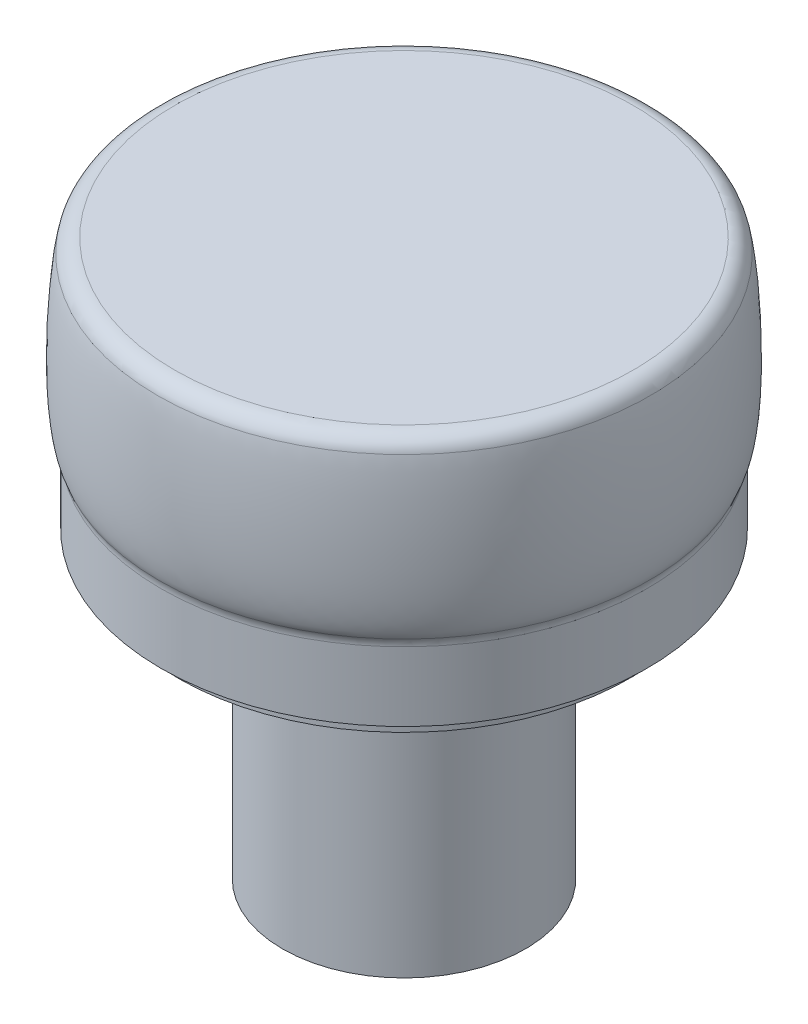
ISO-10303-21;
HEADER;
FILE_DESCRIPTION(('STEP AP214'),'2;1');
FILE_NAME('part.step','',(''),(''),'','','');
FILE_SCHEMA(('AUTOMOTIVE_DESIGN { 1 0 10303 214 1 1 1 1 }'));
ENDSEC;
DATA;
#1=APPLICATION_CONTEXT('core data for automotive mechanical design processes');
#2=APPLICATION_PROTOCOL_DEFINITION('international standard','automotive_design',2000,#1);
#3=PRODUCT_CONTEXT('',#1,'mechanical');
#4=PRODUCT('Part','Part','',(#3));
#5=PRODUCT_RELATED_PRODUCT_CATEGORY('part','',(#4));
#6=PRODUCT_DEFINITION_FORMATION('','',#4);
#7=PRODUCT_DEFINITION_CONTEXT('part definition',#1,'design');
#8=PRODUCT_DEFINITION('design','',#6,#7);
#9=PRODUCT_DEFINITION_SHAPE('','',#8);
#10=(LENGTH_UNIT() NAMED_UNIT(*) SI_UNIT(.MILLI.,.METRE.));
#11=(NAMED_UNIT(*) PLANE_ANGLE_UNIT() SI_UNIT($,.RADIAN.));
#12=(NAMED_UNIT(*) SI_UNIT($,.STERADIAN.) SOLID_ANGLE_UNIT());
#13=UNCERTAINTY_MEASURE_WITH_UNIT(LENGTH_MEASURE(1.E-05),#10,'distance_accuracy_value','');
#14=(GEOMETRIC_REPRESENTATION_CONTEXT(3) GLOBAL_UNCERTAINTY_ASSIGNED_CONTEXT((#13)) GLOBAL_UNIT_ASSIGNED_CONTEXT((#10,
#11,#12)) REPRESENTATION_CONTEXT('',''));
#15=CARTESIAN_POINT('',(0.,0.,0.));
#16=DIRECTION('',(0.,0.,1.));
#17=DIRECTION('',(1.,0.,0.));
#18=AXIS2_PLACEMENT_3D('',#15,#16,#17);
#19=CARTESIAN_POINT('',(0.,18.0202020202011,-13.2168309188764));
#20=DIRECTION('',(0.,-1.,0.));
#21=DIRECTION('',(0.,0.,-1.));
#22=AXIS2_PLACEMENT_3D('',#19,#20,#21);
#23=PLANE('',#22);
#24=CARTESIAN_POINT('',(0.,18.0202020202011,0.));
#25=DIRECTION('',(0.,1.,0.));
#26=DIRECTION('',(0.,0.,1.));
#27=AXIS2_PLACEMENT_3D('',#24,#25,#26);
#28=CIRCLE('',#27,13.2168309188764);
#29=CARTESIAN_POINT('',(0.,18.0202020202011,13.2168309188764));
#30=VERTEX_POINT('',#29);
#31=EDGE_CURVE('E10',#30,#30,#28,.T.);
#32=ORIENTED_EDGE('',*,*,#31,.T.);
#33=EDGE_LOOP('',(#32));
#34=FACE_BOUND('',#33,.T.);
#35=ADVANCED_FACE('F31',(#34),#23,.F.);
#36=CARTESIAN_POINT('',(0.,17.0202020202011,0.));
#37=DIRECTION('',(0.,1.,0.));
#38=DIRECTION('',(0.,0.,1.));
#39=AXIS2_PLACEMENT_3D('',#36,#37,#38);
#40=TOROIDAL_SURFACE('',#39,13.2168309188764,1.);
#41=ORIENTED_EDGE('',*,*,#31,.F.);
#42=EDGE_LOOP('',(#41));
#43=FACE_BOUND('',#42,.T.);
#44=CARTESIAN_POINT('',(0.,17.2314896465535,0.));
#45=DIRECTION('',(0.,1.,0.));
#46=DIRECTION('',(0.,0.,1.));
#47=AXIS2_PLACEMENT_3D('',#44,#45,#46);
#48=CIRCLE('',#47,14.1942548488834);
#49=CARTESIAN_POINT('',(0.,17.2314896465535,14.1942548488834));
#50=VERTEX_POINT('',#49);
#51=EDGE_CURVE('E37',#50,#50,#48,.T.);
#52=ORIENTED_EDGE('',*,*,#51,.T.);
#53=EDGE_LOOP('',(#52));
#54=FACE_BOUND('',#53,.T.);
#55=ADVANCED_FACE('F76',(#43,#54),#40,.T.);
#56=CARTESIAN_POINT('',(0.,7.96561480893513,-14.1151742568969));
#57=CARTESIAN_POINT('',(0.,8.84914365269433,-14.5804134506269));
#58=CARTESIAN_POINT('',(0.,13.1537116554164,-14.6929213645923));
#59=CARTESIAN_POINT('',(0.,16.6294401594539,-14.3243985901713));
#60=CARTESIAN_POINT('',(0.,17.2314896465535,-14.1942548488834));
#61=B_SPLINE_CURVE_WITH_KNOTS('',3,(#56,#57,#58,#59,#60),.UNSPECIFIED.,.F.,.F.,(4,1,4),
(0.108898924807285,0.704576977418865,0.953924023615139),.UNSPECIFIED.);
#62=CARTESIAN_POINT('',(0.,23.3535353535353,0.));
#63=DIRECTION('',(0.,1.,0.));
#64=AXIS1_PLACEMENT('',#62,#63);
#65=SURFACE_OF_REVOLUTION('',#61,#64);
#66=ORIENTED_EDGE('',*,*,#51,.F.);
#67=EDGE_LOOP('',(#66));
#68=FACE_BOUND('',#67,.T.);
#69=CARTESIAN_POINT('',(0.,7.96561480893513,0.));
#70=DIRECTION('',(0.,1.,0.));
#71=DIRECTION('',(0.,0.,1.));
#72=AXIS2_PLACEMENT_3D('',#69,#70,#71);
#73=CIRCLE('',#72,14.1151742568969);
#74=CARTESIAN_POINT('',(0.,7.96561480893513,14.1151742568969));
#75=VERTEX_POINT('',#74);
#76=EDGE_CURVE('E41',#75,#75,#73,.T.);
#77=ORIENTED_EDGE('',*,*,#76,.T.);
#78=EDGE_LOOP('',(#77));
#79=FACE_BOUND('',#78,.T.);
#80=ADVANCED_FACE('F72',(#68,#79),#65,.T.);
#81=CARTESIAN_POINT('',(0.,7.49969270778299,0.));
#82=DIRECTION('',(0.,1.,0.));
#83=DIRECTION('',(0.,0.,1.));
#84=AXIS2_PLACEMENT_3D('',#81,#82,#83);
#85=TOROIDAL_SURFACE('',#84,15.,1.);
#86=ORIENTED_EDGE('',*,*,#76,.F.);
#87=EDGE_LOOP('',(#86));
#88=FACE_BOUND('',#87,.T.);
#89=CARTESIAN_POINT('',(0.,7.49969270778298,0.));
#90=DIRECTION('',(0.,1.,0.));
#91=DIRECTION('',(0.,0.,1.));
#92=AXIS2_PLACEMENT_3D('',#89,#90,#91);
#93=CIRCLE('',#92,14.);
#94=CARTESIAN_POINT('',(0.,7.49969270778298,14.));
#95=VERTEX_POINT('',#94);
#96=EDGE_CURVE('E45',#95,#95,#93,.T.);
#97=ORIENTED_EDGE('',*,*,#96,.T.);
#98=EDGE_LOOP('',(#97));
#99=FACE_BOUND('',#98,.T.);
#100=ADVANCED_FACE('F75',(#88,#99),#85,.F.);
#101=CARTESIAN_POINT('',(0.,23.3535353535353,0.));
#102=DIRECTION('',(0.,1.,0.));
#103=DIRECTION('',(0.,0.,1.));
#104=AXIS2_PLACEMENT_3D('',#101,#102,#103);
#105=CYLINDRICAL_SURFACE('',#104,14.);
#106=ORIENTED_EDGE('',*,*,#96,.F.);
#107=EDGE_LOOP('',(#106));
#108=FACE_BOUND('',#107,.T.);
#109=CARTESIAN_POINT('',(0.,3.52020202020111,0.));
#110=DIRECTION('',(0.,1.,0.));
#111=DIRECTION('',(0.,0.,1.));
#112=AXIS2_PLACEMENT_3D('',#109,#110,#111);
#113=CIRCLE('',#112,14.);
#114=CARTESIAN_POINT('',(0.,3.52020202020111,14.));
#115=VERTEX_POINT('',#114);
#116=EDGE_CURVE('E50',#115,#115,#113,.T.);
#117=ORIENTED_EDGE('',*,*,#116,.T.);
#118=EDGE_LOOP('',(#117));
#119=FACE_BOUND('',#118,.T.);
#120=ADVANCED_FACE('F105',(#108,#119),#105,.T.);
#121=CARTESIAN_POINT('',(0.,3.52020202020111,-13.));
#122=DIRECTION('',(0.,1.,0.));
#123=DIRECTION('',(0.,0.,1.));
#124=AXIS2_PLACEMENT_3D('',#121,#122,#123);
#125=PLANE('',#124);
#126=ORIENTED_EDGE('',*,*,#116,.F.);
#127=EDGE_LOOP('',(#126));
#128=FACE_BOUND('',#127,.T.);
#129=CARTESIAN_POINT('',(0.,3.52020202020111,0.));
#130=DIRECTION('',(0.,1.,0.));
#131=DIRECTION('',(0.,0.,1.));
#132=AXIS2_PLACEMENT_3D('',#129,#130,#131);
#133=CIRCLE('',#132,13.);
#134=CARTESIAN_POINT('',(0.,3.52020202020111,13.));
#135=VERTEX_POINT('',#134);
#136=EDGE_CURVE('E53',#135,#135,#133,.T.);
#137=ORIENTED_EDGE('',*,*,#136,.T.);
#138=EDGE_LOOP('',(#137));
#139=FACE_BOUND('',#138,.T.);
#140=ADVANCED_FACE('F114',(#128,#139),#125,.F.);
#141=CARTESIAN_POINT('',(0.,23.3535353535353,0.));
#142=DIRECTION('',(0.,1.,0.));
#143=DIRECTION('',(0.,0.,1.));
#144=AXIS2_PLACEMENT_3D('',#141,#142,#143);
#145=CYLINDRICAL_SURFACE('',#144,13.);
#146=ORIENTED_EDGE('',*,*,#136,.F.);
#147=EDGE_LOOP('',(#146));
#148=FACE_BOUND('',#147,.T.);
#149=CARTESIAN_POINT('',(0.,2.52020202020111,0.));
#150=DIRECTION('',(0.,1.,0.));
#151=DIRECTION('',(0.,0.,1.));
#152=AXIS2_PLACEMENT_3D('',#149,#150,#151);
#153=CIRCLE('',#152,13.);
#154=CARTESIAN_POINT('',(0.,2.52020202020111,13.));
#155=VERTEX_POINT('',#154);
#156=EDGE_CURVE('E56',#155,#155,#153,.T.);
#157=ORIENTED_EDGE('',*,*,#156,.T.);
#158=EDGE_LOOP('',(#157));
#159=FACE_BOUND('',#158,.T.);
#160=ADVANCED_FACE('F123',(#148,#159),#145,.T.);
#161=CARTESIAN_POINT('',(0.,2.52020202020111,-7.00000000000001));
#162=DIRECTION('',(0.,1.,0.));
#163=DIRECTION('',(0.,0.,1.));
#164=AXIS2_PLACEMENT_3D('',#161,#162,#163);
#165=PLANE('',#164);
#166=ORIENTED_EDGE('',*,*,#156,.F.);
#167=EDGE_LOOP('',(#166));
#168=FACE_BOUND('',#167,.T.);
#169=CARTESIAN_POINT('',(0.,2.52020202020111,0.));
#170=DIRECTION('',(0.,1.,0.));
#171=DIRECTION('',(0.,0.,1.));
#172=AXIS2_PLACEMENT_3D('',#169,#170,#171);
#173=CIRCLE('',#172,7.00000000000001);
#174=CARTESIAN_POINT('',(0.,2.52020202020111,7.00000000000001));
#175=VERTEX_POINT('',#174);
#176=EDGE_CURVE('E59',#175,#175,#173,.T.);
#177=ORIENTED_EDGE('',*,*,#176,.T.);
#178=EDGE_LOOP('',(#177));
#179=FACE_BOUND('',#178,.T.);
#180=ADVANCED_FACE('F133',(#168,#179),#165,.F.);
#181=CARTESIAN_POINT('',(0.,23.3535353535353,0.));
#182=DIRECTION('',(0.,1.,0.));
#183=DIRECTION('',(0.,0.,1.));
#184=AXIS2_PLACEMENT_3D('',#181,#182,#183);
#185=CYLINDRICAL_SURFACE('',#184,7.00000000000001);
#186=ORIENTED_EDGE('',*,*,#176,.F.);
#187=EDGE_LOOP('',(#186));
#188=FACE_BOUND('',#187,.T.);
#189=CARTESIAN_POINT('',(0.,-13.9797979797989,0.));
#190=DIRECTION('',(0.,1.,0.));
#191=DIRECTION('',(0.,0.,1.));
#192=AXIS2_PLACEMENT_3D('',#189,#190,#191);
#193=CIRCLE('',#192,7.00000000000001);
#194=CARTESIAN_POINT('',(0.,-13.9797979797989,7.00000000000001));
#195=VERTEX_POINT('',#194);
#196=EDGE_CURVE('E62',#195,#195,#193,.T.);
#197=ORIENTED_EDGE('',*,*,#196,.T.);
#198=EDGE_LOOP('',(#197));
#199=FACE_BOUND('',#198,.T.);
#200=ADVANCED_FACE('F143',(#188,#199),#185,.T.);
#201=CARTESIAN_POINT('',(0.,-13.9797979797989,0.));
#202=DIRECTION('',(0.,1.,0.));
#203=DIRECTION('',(0.,0.,1.));
#204=AXIS2_PLACEMENT_3D('',#201,#202,#203);
#205=PLANE('',#204);
#206=ORIENTED_EDGE('',*,*,#196,.F.);
#207=EDGE_LOOP('',(#206));
#208=FACE_BOUND('',#207,.T.);
#209=ADVANCED_FACE('F153',(#208),#205,.F.);
#210=CLOSED_SHELL('',(#35,#55,#80,#100,#120,#140,#160,#180,#200,#209));
#211=MANIFOLD_SOLID_BREP('B2',#210);
#212=ADVANCED_BREP_SHAPE_REPRESENTATION('',(#18,#211),#14);
#213=SHAPE_DEFINITION_REPRESENTATION(#9,#212);
ENDSEC;
END-ISO-10303-21;
